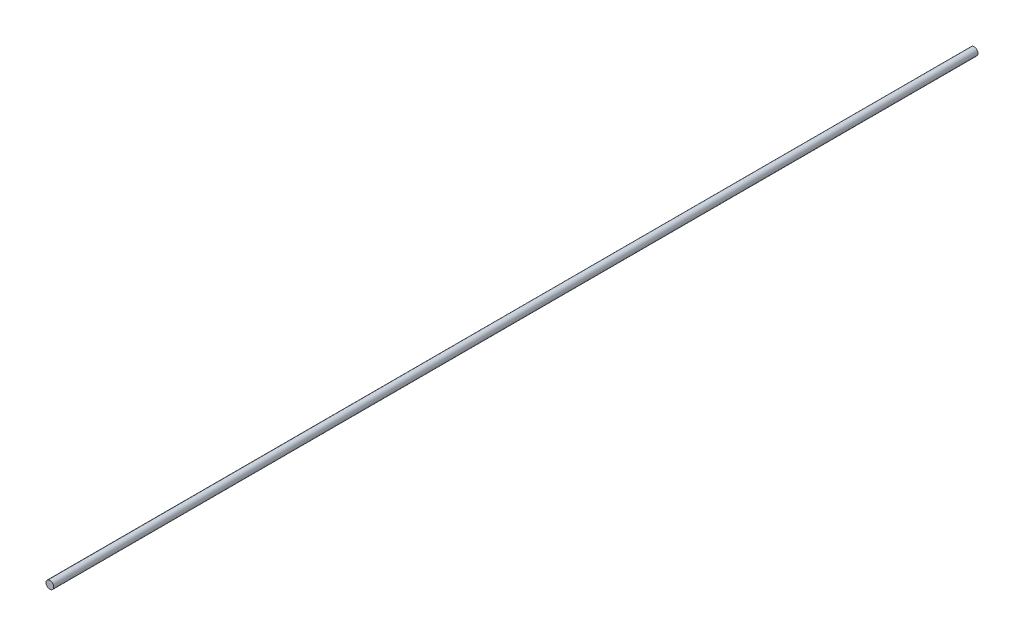
ISO-10303-21;
HEADER;
FILE_DESCRIPTION(('STEP AP214'),'2;1');
FILE_NAME('part.step','',(''),(''),'','','');
FILE_SCHEMA(('AUTOMOTIVE_DESIGN { 1 0 10303 214 1 1 1 1 }'));
ENDSEC;
DATA;
#1=APPLICATION_CONTEXT('core data for automotive mechanical design processes');
#2=APPLICATION_PROTOCOL_DEFINITION('international standard','automotive_design',2000,#1);
#3=PRODUCT_CONTEXT('',#1,'mechanical');
#4=PRODUCT('Part','Part','',(#3));
#5=PRODUCT_RELATED_PRODUCT_CATEGORY('part','',(#4));
#6=PRODUCT_DEFINITION_FORMATION('','',#4);
#7=PRODUCT_DEFINITION_CONTEXT('part definition',#1,'design');
#8=PRODUCT_DEFINITION('design','',#6,#7);
#9=PRODUCT_DEFINITION_SHAPE('','',#8);
#10=(LENGTH_UNIT() NAMED_UNIT(*) SI_UNIT(.MILLI.,.METRE.));
#11=(NAMED_UNIT(*) PLANE_ANGLE_UNIT() SI_UNIT($,.RADIAN.));
#12=(NAMED_UNIT(*) SI_UNIT($,.STERADIAN.) SOLID_ANGLE_UNIT());
#13=UNCERTAINTY_MEASURE_WITH_UNIT(LENGTH_MEASURE(1.E-05),#10,'distance_accuracy_value','');
#14=(GEOMETRIC_REPRESENTATION_CONTEXT(3) GLOBAL_UNCERTAINTY_ASSIGNED_CONTEXT((#13)) GLOBAL_UNIT_ASSIGNED_CONTEXT((#10,
#11,#12)) REPRESENTATION_CONTEXT('',''));
#15=CARTESIAN_POINT('',(0.,0.,0.));
#16=DIRECTION('',(0.,0.,1.));
#17=DIRECTION('',(1.,0.,0.));
#18=AXIS2_PLACEMENT_3D('',#15,#16,#17);
#19=CARTESIAN_POINT('',(0.,0.,360.));
#20=DIRECTION('',(0.,0.,-1.));
#21=DIRECTION('',(-1.,0.,0.));
#22=AXIS2_PLACEMENT_3D('',#19,#20,#21);
#23=CYLINDRICAL_SURFACE('',#22,1.5);
#24=CARTESIAN_POINT('',(0.,0.,360.));
#25=DIRECTION('',(0.,0.,1.));
#26=DIRECTION('',(1.,0.,0.));
#27=AXIS2_PLACEMENT_3D('',#24,#25,#26);
#28=CIRCLE('',#27,1.5);
#29=CARTESIAN_POINT('',(1.5,0.,360.));
#30=VERTEX_POINT('',#29);
#31=EDGE_CURVE('E10',#30,#30,#28,.T.);
#32=ORIENTED_EDGE('',*,*,#31,.F.);
#33=EDGE_LOOP('',(#32));
#34=FACE_BOUND('',#33,.T.);
#35=CARTESIAN_POINT('',(0.,0.,0.));
#36=DIRECTION('',(0.,0.,1.));
#37=DIRECTION('',(1.,0.,0.));
#38=AXIS2_PLACEMENT_3D('',#35,#36,#37);
#39=CIRCLE('',#38,1.5);
#40=CARTESIAN_POINT('',(1.5,0.,0.));
#41=VERTEX_POINT('',#40);
#42=EDGE_CURVE('E40',#41,#41,#39,.T.);
#43=ORIENTED_EDGE('',*,*,#42,.T.);
#44=EDGE_LOOP('',(#43));
#45=FACE_BOUND('',#44,.T.);
#46=ADVANCED_FACE('F37',(#34,#45),#23,.T.);
#47=CARTESIAN_POINT('',(0.,0.,360.));
#48=DIRECTION('',(0.,0.,1.));
#49=DIRECTION('',(1.,0.,0.));
#50=AXIS2_PLACEMENT_3D('',#47,#48,#49);
#51=PLANE('',#50);
#52=ORIENTED_EDGE('',*,*,#31,.T.);
#53=EDGE_LOOP('',(#52));
#54=FACE_BOUND('',#53,.T.);
#55=ADVANCED_FACE('F54',(#54),#51,.T.);
#56=CARTESIAN_POINT('',(0.,0.,0.));
#57=DIRECTION('',(0.,0.,1.));
#58=DIRECTION('',(1.,0.,0.));
#59=AXIS2_PLACEMENT_3D('',#56,#57,#58);
#60=PLANE('',#59);
#61=ORIENTED_EDGE('',*,*,#42,.F.);
#62=EDGE_LOOP('',(#61));
#63=FACE_BOUND('',#62,.T.);
#64=ADVANCED_FACE('F52',(#63),#60,.F.);
#65=CLOSED_SHELL('',(#46,#55,#64));
#66=MANIFOLD_SOLID_BREP('B2',#65);
#67=ADVANCED_BREP_SHAPE_REPRESENTATION('',(#18,#66),#14);
#68=SHAPE_DEFINITION_REPRESENTATION(#9,#67);
ENDSEC;
END-ISO-10303-21;
